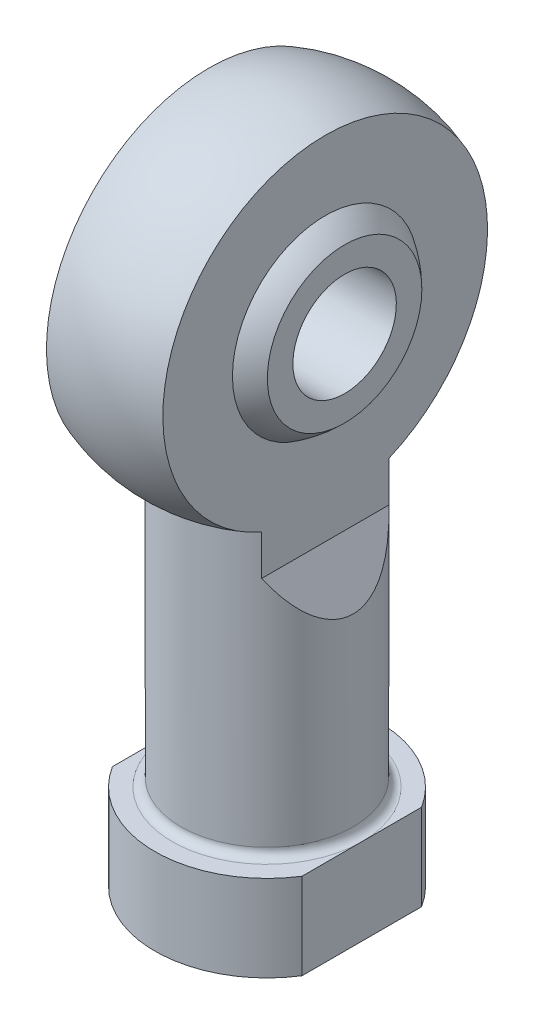
ISO-10303-21;
HEADER;
FILE_DESCRIPTION(('STEP AP214'),'2;1');
FILE_NAME('part.step','',(''),(''),'','','');
FILE_SCHEMA(('AUTOMOTIVE_DESIGN { 1 0 10303 214 1 1 1 1 }'));
ENDSEC;
DATA;
#1=APPLICATION_CONTEXT('core data for automotive mechanical design processes');
#2=APPLICATION_PROTOCOL_DEFINITION('international standard','automotive_design',2000,#1);
#3=PRODUCT_CONTEXT('',#1,'mechanical');
#4=PRODUCT('Part','Part','',(#3));
#5=PRODUCT_RELATED_PRODUCT_CATEGORY('part','',(#4));
#6=PRODUCT_DEFINITION_FORMATION('','',#4);
#7=PRODUCT_DEFINITION_CONTEXT('part definition',#1,'design');
#8=PRODUCT_DEFINITION('design','',#6,#7);
#9=PRODUCT_DEFINITION_SHAPE('','',#8);
#10=(LENGTH_UNIT() NAMED_UNIT(*) SI_UNIT(.MILLI.,.METRE.));
#11=(NAMED_UNIT(*) PLANE_ANGLE_UNIT() SI_UNIT($,.RADIAN.));
#12=(NAMED_UNIT(*) SI_UNIT($,.STERADIAN.) SOLID_ANGLE_UNIT());
#13=UNCERTAINTY_MEASURE_WITH_UNIT(LENGTH_MEASURE(1.E-05),#10,'distance_accuracy_value','');
#14=(GEOMETRIC_REPRESENTATION_CONTEXT(3) GLOBAL_UNCERTAINTY_ASSIGNED_CONTEXT((#13)) GLOBAL_UNIT_ASSIGNED_CONTEXT((#10,
#11,#12)) REPRESENTATION_CONTEXT('',''));
#15=CARTESIAN_POINT('',(0.,0.,0.));
#16=DIRECTION('',(0.,0.,1.));
#17=DIRECTION('',(1.,0.,0.));
#18=AXIS2_PLACEMENT_3D('',#15,#16,#17);
#19=CARTESIAN_POINT('',(0.,-15.0000000014074,0.));
#20=DIRECTION('',(0.,-1.,0.));
#21=DIRECTION('',(1.,0.,0.));
#22=AXIS2_PLACEMENT_3D('',#19,#20,#21);
#23=CONICAL_SURFACE('',#22,2.45849999907933,1.02974425745765);
#24=CARTESIAN_POINT('',(1.13686837721616E-10,-13.5227841660708,0.));
#25=VERTEX_POINT('',#24);
#26=VERTEX_LOOP('',#25);
#27=FACE_BOUND('',#26,.T.);
#28=CARTESIAN_POINT('',(0.,-15.,0.));
#29=DIRECTION('',(0.,-1.,0.));
#30=DIRECTION('',(1.,0.,0.));
#31=AXIS2_PLACEMENT_3D('',#28,#29,#30);
#32=CIRCLE('',#31,2.4585);
#33=CARTESIAN_POINT('',(2.4585,-15.,0.));
#34=VERTEX_POINT('',#33);
#35=EDGE_CURVE('E120',#34,#34,#32,.T.);
#36=ORIENTED_EDGE('',*,*,#35,.T.);
#37=EDGE_LOOP('',(#36));
#38=FACE_BOUND('',#37,.T.);
#39=ADVANCED_FACE('F17',(#27,#38),#23,.F.);
#40=CARTESIAN_POINT('',(0.,-22.5,0.));
#41=DIRECTION('',(0.,-1.,0.));
#42=DIRECTION('',(1.,0.,0.));
#43=AXIS2_PLACEMENT_3D('',#40,#41,#42);
#44=CYLINDRICAL_SURFACE('',#43,2.4585);
#45=CARTESIAN_POINT('',(0.,-29.4999999997572,0.));
#46=DIRECTION('',(0.,-1.,0.));
#47=DIRECTION('',(1.,0.,0.));
#48=AXIS2_PLACEMENT_3D('',#45,#46,#47);
#49=CIRCLE('',#48,2.45850000021618);
#50=CARTESIAN_POINT('',(2.45850000021619,-29.4999999997572,0.));
#51=VERTEX_POINT('',#50);
#52=EDGE_CURVE('E117',#51,#51,#49,.T.);
#53=ORIENTED_EDGE('',*,*,#52,.T.);
#54=EDGE_LOOP('',(#53));
#55=FACE_BOUND('',#54,.T.);
#56=ORIENTED_EDGE('',*,*,#35,.F.);
#57=EDGE_LOOP('',(#56));
#58=FACE_BOUND('',#57,.T.);
#59=ADVANCED_FACE('F181',(#55,#58),#44,.F.);
#60=CARTESIAN_POINT('',(0.,-30.0000000002001,0.));
#61=DIRECTION('',(0.,-1.,0.));
#62=DIRECTION('',(0.,0.,-1.));
#63=AXIS2_PLACEMENT_3D('',#60,#61,#62);
#64=CONICAL_SURFACE('',#63,2.95849999974961,0.785398162487953);
#65=CARTESIAN_POINT('',(0.,-30.0000000002001,0.));
#66=DIRECTION('',(0.,-1.,0.));
#67=DIRECTION('',(0.,0.,-1.));
#68=AXIS2_PLACEMENT_3D('',#65,#66,#67);
#69=CIRCLE('',#68,2.95849999974961);
#70=CARTESIAN_POINT('',(0.,-30.0000000002001,-2.95849999974961));
#71=VERTEX_POINT('',#70);
#72=EDGE_CURVE('E20',#71,#71,#69,.F.);
#73=ORIENTED_EDGE('',*,*,#72,.F.);
#74=EDGE_LOOP('',(#73));
#75=FACE_BOUND('',#74,.T.);
#76=ORIENTED_EDGE('',*,*,#52,.F.);
#77=EDGE_LOOP('',(#76));
#78=FACE_BOUND('',#77,.T.);
#79=ADVANCED_FACE('F177',(#75,#78),#64,.F.);
#80=CARTESIAN_POINT('',(42.6793157586781,0.,0.));
#81=DIRECTION('',(-1.,0.,0.));
#82=DIRECTION('',(0.,-1.,0.));
#83=AXIS2_PLACEMENT_3D('',#80,#81,#82);
#84=CYLINDRICAL_SURFACE('',#83,3.);
#85=CARTESIAN_POINT('',(-4.49999999999999,0.,0.));
#86=DIRECTION('',(-1.,0.,0.));
#87=DIRECTION('',(0.,-1.,0.));
#88=AXIS2_PLACEMENT_3D('',#85,#86,#87);
#89=CIRCLE('',#88,3.);
#90=CARTESIAN_POINT('',(-4.49999999999999,-3.,0.));
#91=VERTEX_POINT('',#90);
#92=EDGE_CURVE('E169',#91,#91,#89,.F.);
#93=ORIENTED_EDGE('',*,*,#92,.F.);
#94=EDGE_LOOP('',(#93));
#95=FACE_BOUND('',#94,.T.);
#96=CARTESIAN_POINT('',(4.5,0.,0.));
#97=DIRECTION('',(-1.,0.,0.));
#98=DIRECTION('',(0.,-1.,0.));
#99=AXIS2_PLACEMENT_3D('',#96,#97,#98);
#100=CIRCLE('',#99,3.);
#101=CARTESIAN_POINT('',(4.5,-3.,0.));
#102=VERTEX_POINT('',#101);
#103=EDGE_CURVE('E94',#102,#102,#100,.T.);
#104=ORIENTED_EDGE('',*,*,#103,.F.);
#105=EDGE_LOOP('',(#104));
#106=FACE_BOUND('',#105,.T.);
#107=ADVANCED_FACE('F180',(#95,#106),#84,.F.);
#108=CARTESIAN_POINT('',(3.25000000000001,-30.,0.));
#109=DIRECTION('',(0.,-1.,0.));
#110=DIRECTION('',(0.,0.,-1.));
#111=AXIS2_PLACEMENT_3D('',#108,#109,#110);
#112=PLANE('',#111);
#113=ORIENTED_EDGE('',*,*,#72,.T.);
#114=EDGE_LOOP('',(#113));
#115=FACE_BOUND('',#114,.T.);
#116=DIRECTION('',(0.,0.,-1.));
#117=VECTOR('',#116,1.);
#118=CARTESIAN_POINT('',(-5.49999999999999,-30.,-3.46410161513775));
#119=LINE('',#118,#117);
#120=CARTESIAN_POINT('',(-5.49999999999999,-30.,3.46410161513775));
#121=VERTEX_POINT('',#120);
#122=CARTESIAN_POINT('',(-5.49999999999999,-30.,-3.46410161513775));
#123=VERTEX_POINT('',#122);
#124=EDGE_CURVE('E89',#121,#123,#119,.T.);
#125=ORIENTED_EDGE('',*,*,#124,.T.);
#126=CARTESIAN_POINT('',(0.,-30.,0.));
#127=DIRECTION('',(0.,-1.,0.));
#128=DIRECTION('',(1.,0.,0.));
#129=AXIS2_PLACEMENT_3D('',#126,#127,#128);
#130=CIRCLE('',#129,6.5);
#131=CARTESIAN_POINT('',(5.50000000000001,-30.,-3.46410161513775));
#132=VERTEX_POINT('',#131);
#133=EDGE_CURVE('E104',#132,#123,#130,.F.);
#134=ORIENTED_EDGE('',*,*,#133,.F.);
#135=DIRECTION('',(0.,0.,1.));
#136=VECTOR('',#135,1.);
#137=CARTESIAN_POINT('',(5.50000000000001,-30.,3.46410161513775));
#138=LINE('',#137,#136);
#139=CARTESIAN_POINT('',(5.50000000000001,-30.,3.46410161513775));
#140=VERTEX_POINT('',#139);
#141=EDGE_CURVE('E91',#132,#140,#138,.T.);
#142=ORIENTED_EDGE('',*,*,#141,.T.);
#143=CARTESIAN_POINT('',(0.,-30.,0.));
#144=DIRECTION('',(0.,-1.,0.));
#145=DIRECTION('',(1.,0.,0.));
#146=AXIS2_PLACEMENT_3D('',#143,#144,#145);
#147=CIRCLE('',#146,6.5);
#148=EDGE_CURVE('E84',#121,#140,#147,.F.);
#149=ORIENTED_EDGE('',*,*,#148,.F.);
#150=EDGE_LOOP('',(#125,#134,#142,#149));
#151=FACE_BOUND('',#150,.T.);
#152=ADVANCED_FACE('F86',(#115,#151),#112,.T.);
#153=CARTESIAN_POINT('',(-4.49999999999999,0.,3.74011718443478));
#154=DIRECTION('',(-1.,0.,0.));
#155=DIRECTION('',(0.,0.,1.));
#156=AXIS2_PLACEMENT_3D('',#153,#154,#155);
#157=PLANE('',#156);
#158=ORIENTED_EDGE('',*,*,#92,.T.);
#159=EDGE_LOOP('',(#158));
#160=FACE_BOUND('',#159,.T.);
#161=CARTESIAN_POINT('',(-4.49999999999999,0.,0.));
#162=DIRECTION('',(1.,0.,0.));
#163=DIRECTION('',(0.,0.,-1.));
#164=AXIS2_PLACEMENT_3D('',#161,#162,#163);
#165=CIRCLE('',#164,4.48023436886956);
#166=CARTESIAN_POINT('',(-4.49999999999999,0.,-4.48023436886956));
#167=VERTEX_POINT('',#166);
#168=EDGE_CURVE('E111',#167,#167,#165,.T.);
#169=ORIENTED_EDGE('',*,*,#168,.F.);
#170=EDGE_LOOP('',(#169));
#171=FACE_BOUND('',#170,.T.);
#172=ADVANCED_FACE('F326',(#160,#171),#157,.T.);
#173=CARTESIAN_POINT('',(4.50000000000001,0.,3.74011718443478));
#174=DIRECTION('',(1.,0.,0.));
#175=DIRECTION('',(0.,0.,-1.));
#176=AXIS2_PLACEMENT_3D('',#173,#174,#175);
#177=PLANE('',#176);
#178=ORIENTED_EDGE('',*,*,#103,.T.);
#179=EDGE_LOOP('',(#178));
#180=FACE_BOUND('',#179,.T.);
#181=CARTESIAN_POINT('',(4.50000000000001,0.,0.));
#182=DIRECTION('',(1.,0.,0.));
#183=DIRECTION('',(0.,0.,-1.));
#184=AXIS2_PLACEMENT_3D('',#181,#182,#183);
#185=CIRCLE('',#184,4.48023436886955);
#186=CARTESIAN_POINT('',(4.50000000000001,0.,-4.48023436886955));
#187=VERTEX_POINT('',#186);
#188=EDGE_CURVE('E160',#187,#187,#185,.F.);
#189=ORIENTED_EDGE('',*,*,#188,.F.);
#190=EDGE_LOOP('',(#189));
#191=FACE_BOUND('',#190,.T.);
#192=ADVANCED_FACE('F323',(#180,#191),#177,.T.);
#193=CARTESIAN_POINT('',(0.,-27.5,0.));
#194=DIRECTION('',(0.,-1.,0.));
#195=DIRECTION('',(1.,0.,0.));
#196=AXIS2_PLACEMENT_3D('',#193,#194,#195);
#197=CYLINDRICAL_SURFACE('',#196,6.5);
#198=DIRECTION('',(0.,1.,0.));
#199=VECTOR('',#198,1.);
#200=CARTESIAN_POINT('',(-5.49999999999999,-30.,3.46410161513776));
#201=LINE('',#200,#199);
#202=CARTESIAN_POINT('',(-5.49999999999999,-25.,3.46410161513775));
#203=VERTEX_POINT('',#202);
#204=EDGE_CURVE('E97',#203,#121,#201,.F.);
#205=ORIENTED_EDGE('',*,*,#204,.T.);
#206=ORIENTED_EDGE('',*,*,#148,.T.);
#207=DIRECTION('',(0.,1.,0.));
#208=VECTOR('',#207,1.);
#209=CARTESIAN_POINT('',(5.50000000000001,-30.,3.46410161513775));
#210=LINE('',#209,#208);
#211=CARTESIAN_POINT('',(5.50000000000001,-25.,3.46410161513775));
#212=VERTEX_POINT('',#211);
#213=EDGE_CURVE('E115',#140,#212,#210,.T.);
#214=ORIENTED_EDGE('',*,*,#213,.T.);
#215=CARTESIAN_POINT('',(0.,-25.,0.));
#216=DIRECTION('',(0.,-1.,0.));
#217=DIRECTION('',(1.,0.,0.));
#218=AXIS2_PLACEMENT_3D('',#215,#216,#217);
#219=CIRCLE('',#218,6.5);
#220=EDGE_CURVE('E100',#203,#212,#219,.F.);
#221=ORIENTED_EDGE('',*,*,#220,.F.);
#222=EDGE_LOOP('',(#205,#206,#214,#221));
#223=FACE_BOUND('',#222,.T.);
#224=ADVANCED_FACE('F98',(#223),#197,.T.);
#225=CARTESIAN_POINT('',(5.50000000000001,-30.,3.46410161513775));
#226=DIRECTION('',(-1.,0.,0.));
#227=DIRECTION('',(0.,0.,1.));
#228=AXIS2_PLACEMENT_3D('',#225,#226,#227);
#229=PLANE('',#228);
#230=ORIENTED_EDGE('',*,*,#213,.F.);
#231=ORIENTED_EDGE('',*,*,#141,.F.);
#232=DIRECTION('',(0.,-1.,0.));
#233=VECTOR('',#232,1.);
#234=CARTESIAN_POINT('',(5.50000000000001,-27.5,-3.46410161513776));
#235=LINE('',#234,#233);
#236=CARTESIAN_POINT('',(5.50000000000001,-25.,-3.46410161513775));
#237=VERTEX_POINT('',#236);
#238=EDGE_CURVE('E166',#237,#132,#235,.T.);
#239=ORIENTED_EDGE('',*,*,#238,.F.);
#240=DIRECTION('',(0.,0.,1.));
#241=VECTOR('',#240,1.);
#242=CARTESIAN_POINT('',(5.50000000000001,-25.,0.));
#243=LINE('',#242,#241);
#244=CARTESIAN_POINT('',(5.50000000000001,-25.,0.));
#245=VERTEX_POINT('',#244);
#246=EDGE_CURVE('E157',#245,#237,#243,.F.);
#247=ORIENTED_EDGE('',*,*,#246,.F.);
#248=DIRECTION('',(0.,0.,1.));
#249=VECTOR('',#248,1.);
#250=CARTESIAN_POINT('',(5.50000000000001,-25.,0.));
#251=LINE('',#250,#249);
#252=EDGE_CURVE('E163',#212,#245,#251,.F.);
#253=ORIENTED_EDGE('',*,*,#252,.F.);
#254=EDGE_LOOP('',(#230,#231,#239,#247,#253));
#255=FACE_BOUND('',#254,.T.);
#256=ADVANCED_FACE('F316',(#255),#229,.F.);
#257=CARTESIAN_POINT('',(0.,-27.5,0.));
#258=DIRECTION('',(0.,-1.,0.));
#259=DIRECTION('',(1.,0.,0.));
#260=AXIS2_PLACEMENT_3D('',#257,#258,#259);
#261=CYLINDRICAL_SURFACE('',#260,6.5);
#262=DIRECTION('',(0.,1.,0.));
#263=VECTOR('',#262,1.);
#264=CARTESIAN_POINT('',(-5.49999999999999,-30.,-3.46410161513775));
#265=LINE('',#264,#263);
#266=CARTESIAN_POINT('',(-5.49999999999999,-25.,-3.46410161513775));
#267=VERTEX_POINT('',#266);
#268=EDGE_CURVE('E109',#123,#267,#265,.T.);
#269=ORIENTED_EDGE('',*,*,#268,.T.);
#270=CARTESIAN_POINT('',(0.,-25.,0.));
#271=DIRECTION('',(0.,-1.,0.));
#272=DIRECTION('',(1.,0.,0.));
#273=AXIS2_PLACEMENT_3D('',#270,#271,#272);
#274=CIRCLE('',#273,6.5);
#275=EDGE_CURVE('E153',#237,#267,#274,.F.);
#276=ORIENTED_EDGE('',*,*,#275,.F.);
#277=ORIENTED_EDGE('',*,*,#238,.T.);
#278=ORIENTED_EDGE('',*,*,#133,.T.);
#279=EDGE_LOOP('',(#269,#276,#277,#278));
#280=FACE_BOUND('',#279,.T.);
#281=ADVANCED_FACE('F313',(#280),#261,.T.);
#282=CARTESIAN_POINT('',(-5.49999999999999,-30.,-3.46410161513775));
#283=DIRECTION('',(1.,0.,0.));
#284=DIRECTION('',(0.,0.,-1.));
#285=AXIS2_PLACEMENT_3D('',#282,#283,#284);
#286=PLANE('',#285);
#287=ORIENTED_EDGE('',*,*,#268,.F.);
#288=ORIENTED_EDGE('',*,*,#124,.F.);
#289=ORIENTED_EDGE('',*,*,#204,.F.);
#290=DIRECTION('',(0.,0.,1.));
#291=VECTOR('',#290,1.);
#292=CARTESIAN_POINT('',(-5.49999999999999,-25.,0.));
#293=LINE('',#292,#291);
#294=CARTESIAN_POINT('',(-5.49999999999999,-25.,0.));
#295=VERTEX_POINT('',#294);
#296=EDGE_CURVE('E159',#295,#203,#293,.T.);
#297=ORIENTED_EDGE('',*,*,#296,.F.);
#298=DIRECTION('',(0.,0.,1.));
#299=VECTOR('',#298,1.);
#300=CARTESIAN_POINT('',(-5.49999999999999,-25.,0.));
#301=LINE('',#300,#299);
#302=EDGE_CURVE('E156',#267,#295,#301,.T.);
#303=ORIENTED_EDGE('',*,*,#302,.F.);
#304=EDGE_LOOP('',(#287,#288,#289,#297,#303));
#305=FACE_BOUND('',#304,.T.);
#306=ADVANCED_FACE('F107',(#305),#286,.F.);
#307=CARTESIAN_POINT('',(0.,0.,0.));
#308=DIRECTION('',(1.,0.,0.));
#309=DIRECTION('',(0.,1.,0.));
#310=AXIS2_PLACEMENT_3D('',#307,#308,#309);
#311=SPHERICAL_SURFACE('',#310,6.35);
#312=CARTESIAN_POINT('',(-3.37500000000001,0.,0.));
#313=DIRECTION('',(1.,0.,0.));
#314=DIRECTION('',(0.,0.,-1.));
#315=AXIS2_PLACEMENT_3D('',#312,#313,#314);
#316=CIRCLE('',#315,5.37883584058855);
#317=CARTESIAN_POINT('',(-3.37500000000001,0.,-5.37883584058855));
#318=VERTEX_POINT('',#317);
#319=EDGE_CURVE('E149',#318,#318,#316,.F.);
#320=ORIENTED_EDGE('',*,*,#319,.T.);
#321=EDGE_LOOP('',(#320));
#322=FACE_BOUND('',#321,.T.);
#323=ORIENTED_EDGE('',*,*,#168,.T.);
#324=EDGE_LOOP('',(#323));
#325=FACE_BOUND('',#324,.T.);
#326=ADVANCED_FACE('F306',(#322,#325),#311,.T.);
#327=CARTESIAN_POINT('',(0.,0.,0.));
#328=DIRECTION('',(1.,0.,0.));
#329=DIRECTION('',(0.,1.,0.));
#330=AXIS2_PLACEMENT_3D('',#327,#328,#329);
#331=SPHERICAL_SURFACE('',#330,6.35);
#332=CARTESIAN_POINT('',(3.375,0.,0.));
#333=DIRECTION('',(1.,0.,0.));
#334=DIRECTION('',(0.,0.,-1.));
#335=AXIS2_PLACEMENT_3D('',#332,#333,#334);
#336=CIRCLE('',#335,5.37883584058856);
#337=CARTESIAN_POINT('',(3.375,0.,-5.37883584058856));
#338=VERTEX_POINT('',#337);
#339=EDGE_CURVE('E142',#338,#338,#336,.T.);
#340=ORIENTED_EDGE('',*,*,#339,.T.);
#341=EDGE_LOOP('',(#340));
#342=FACE_BOUND('',#341,.T.);
#343=ORIENTED_EDGE('',*,*,#188,.T.);
#344=EDGE_LOOP('',(#343));
#345=FACE_BOUND('',#344,.T.);
#346=ADVANCED_FACE('F303',(#342,#345),#331,.T.);
#347=CARTESIAN_POINT('',(5.75000000000001,-25.,0.));
#348=DIRECTION('',(0.,1.,0.));
#349=DIRECTION('',(0.,0.,1.));
#350=AXIS2_PLACEMENT_3D('',#347,#348,#349);
#351=PLANE('',#350);
#352=ORIENTED_EDGE('',*,*,#296,.T.);
#353=ORIENTED_EDGE('',*,*,#220,.T.);
#354=ORIENTED_EDGE('',*,*,#252,.T.);
#355=CARTESIAN_POINT('',(0.,-25.,0.));
#356=DIRECTION('',(0.,1.,0.));
#357=DIRECTION('',(-1.,0.,0.));
#358=AXIS2_PLACEMENT_3D('',#355,#356,#357);
#359=CIRCLE('',#358,5.5);
#360=EDGE_CURVE('E218',#245,#295,#359,.F.);
#361=ORIENTED_EDGE('',*,*,#360,.T.);
#362=EDGE_LOOP('',(#352,#353,#354,#361));
#363=FACE_BOUND('',#362,.T.);
#364=ADVANCED_FACE('F240',(#363),#351,.T.);
#365=CARTESIAN_POINT('',(5.75000000000001,-25.,0.));
#366=DIRECTION('',(0.,1.,0.));
#367=DIRECTION('',(0.,0.,1.));
#368=AXIS2_PLACEMENT_3D('',#365,#366,#367);
#369=PLANE('',#368);
#370=ORIENTED_EDGE('',*,*,#302,.T.);
#371=CARTESIAN_POINT('',(0.,-25.,0.));
#372=DIRECTION('',(0.,1.,0.));
#373=DIRECTION('',(1.,0.,0.));
#374=AXIS2_PLACEMENT_3D('',#371,#372,#373);
#375=CIRCLE('',#374,5.5);
#376=EDGE_CURVE('E264',#295,#245,#375,.F.);
#377=ORIENTED_EDGE('',*,*,#376,.T.);
#378=ORIENTED_EDGE('',*,*,#246,.T.);
#379=ORIENTED_EDGE('',*,*,#275,.T.);
#380=EDGE_LOOP('',(#370,#377,#378,#379));
#381=FACE_BOUND('',#380,.T.);
#382=ADVANCED_FACE('F235',(#381),#369,.T.);
#383=CARTESIAN_POINT('',(-3.375,-11.,0.));
#384=DIRECTION('',(0.866025403784439,-0.499999999999999,0.));
#385=DIRECTION('',(0.499999999999999,0.866025403784439,0.));
#386=AXIS2_PLACEMENT_3D('',#383,#384,#385);
#387=PLANE('',#386);
#388=DIRECTION('',(0.,0.,-1.));
#389=VECTOR('',#388,1.);
#390=CARTESIAN_POINT('',(-3.37500000000001,-11.,0.));
#391=LINE('',#390,#389);
#392=CARTESIAN_POINT('',(-3.375,-11.,3.68908864084343));
#393=VERTEX_POINT('',#392);
#394=CARTESIAN_POINT('',(-3.375,-11.,-3.68908864084343));
#395=VERTEX_POINT('',#394);
#396=EDGE_CURVE('E152',#393,#395,#391,.T.);
#397=ORIENTED_EDGE('',*,*,#396,.T.);
#398=CARTESIAN_POINT('',(0.,-5.15432852445503,0.));
#399=DIRECTION('',(0.866025403784439,-0.499999999999999,0.));
#400=DIRECTION('',(-0.499999999999999,-0.866025403784439,0.));
#401=AXIS2_PLACEMENT_3D('',#398,#399,#400);
#402=ELLIPSE('',#401,10.,5.);
#403=EDGE_CURVE('E134',#393,#395,#402,.T.);
#404=ORIENTED_EDGE('',*,*,#403,.F.);
#405=EDGE_LOOP('',(#397,#404));
#406=FACE_BOUND('',#405,.T.);
#407=ADVANCED_FACE('F231',(#406),#387,.F.);
#408=CARTESIAN_POINT('',(-3.37500000000001,19.5728266199103,0.));
#409=DIRECTION('',(1.,0.,0.));
#410=DIRECTION('',(0.,0.,-1.));
#411=AXIS2_PLACEMENT_3D('',#408,#409,#410);
#412=PLANE('',#411);
#413=ORIENTED_EDGE('',*,*,#319,.F.);
#414=EDGE_LOOP('',(#413));
#415=FACE_BOUND('',#414,.T.);
#416=ORIENTED_EDGE('',*,*,#396,.F.);
#417=DIRECTION('',(0.,-1.,0.));
#418=VECTOR('',#417,1.);
#419=CARTESIAN_POINT('',(-3.37499999999999,-16.8301270189222,3.68908864084343));
#420=LINE('',#419,#418);
#421=CARTESIAN_POINT('',(-3.375,-8.66025403784439,3.68908864084342));
#422=VERTEX_POINT('',#421);
#423=EDGE_CURVE('E137',#422,#393,#420,.T.);
#424=ORIENTED_EDGE('',*,*,#423,.F.);
#425=CARTESIAN_POINT('',(-3.37500000000001,0.,0.));
#426=DIRECTION('',(1.,0.,0.));
#427=DIRECTION('',(0.,0.,-1.));
#428=AXIS2_PLACEMENT_3D('',#425,#426,#427);
#429=CIRCLE('',#428,9.41325528178218);
#430=CARTESIAN_POINT('',(-3.375,-8.66025403784439,-3.68908864084342));
#431=VERTEX_POINT('',#430);
#432=EDGE_CURVE('E147',#431,#422,#429,.T.);
#433=ORIENTED_EDGE('',*,*,#432,.F.);
#434=DIRECTION('',(0.,-1.,0.));
#435=VECTOR('',#434,1.);
#436=CARTESIAN_POINT('',(-3.37499999999999,-16.8301270189222,-3.68908864084343));
#437=LINE('',#436,#435);
#438=EDGE_CURVE('E133',#395,#431,#437,.F.);
#439=ORIENTED_EDGE('',*,*,#438,.F.);
#440=EDGE_LOOP('',(#416,#424,#433,#439));
#441=FACE_BOUND('',#440,.T.);
#442=ADVANCED_FACE('F227',(#415,#441),#412,.F.);
#443=CARTESIAN_POINT('',(0.,0.,0.));
#444=DIRECTION('',(1.,0.,0.));
#445=DIRECTION('',(0.,1.,0.));
#446=AXIS2_PLACEMENT_3D('',#443,#444,#445);
#447=SPHERICAL_SURFACE('',#446,10.);
#448=ORIENTED_EDGE('',*,*,#432,.T.);
#449=CARTESIAN_POINT('',(0.,-8.66025403784439,0.));
#450=DIRECTION('',(0.,-1.,0.));
#451=DIRECTION('',(1.,0.,0.));
#452=AXIS2_PLACEMENT_3D('',#449,#450,#451);
#453=CIRCLE('',#452,5.);
#454=CARTESIAN_POINT('',(3.375,-8.66025403784439,3.68908864084343));
#455=VERTEX_POINT('',#454);
#456=EDGE_CURVE('E138',#455,#422,#453,.T.);
#457=ORIENTED_EDGE('',*,*,#456,.F.);
#458=CARTESIAN_POINT('',(3.375,0.,0.));
#459=DIRECTION('',(1.,0.,0.));
#460=DIRECTION('',(0.,0.,-1.));
#461=AXIS2_PLACEMENT_3D('',#458,#459,#460);
#462=CIRCLE('',#461,9.41325528178217);
#463=CARTESIAN_POINT('',(3.375,-8.66025403784438,-3.68908864084343));
#464=VERTEX_POINT('',#463);
#465=EDGE_CURVE('E145',#455,#464,#462,.F.);
#466=ORIENTED_EDGE('',*,*,#465,.T.);
#467=CARTESIAN_POINT('',(0.,-8.66025403784439,0.));
#468=DIRECTION('',(0.,-1.,0.));
#469=DIRECTION('',(1.,0.,0.));
#470=AXIS2_PLACEMENT_3D('',#467,#468,#469);
#471=CIRCLE('',#470,5.);
#472=EDGE_CURVE('E130',#431,#464,#471,.T.);
#473=ORIENTED_EDGE('',*,*,#472,.F.);
#474=EDGE_LOOP('',(#448,#457,#466,#473));
#475=FACE_BOUND('',#474,.T.);
#476=ADVANCED_FACE('F223',(#475),#447,.T.);
#477=CARTESIAN_POINT('',(3.375,-11.,0.));
#478=DIRECTION('',(-1.,0.,0.));
#479=DIRECTION('',(0.,0.,1.));
#480=AXIS2_PLACEMENT_3D('',#477,#478,#479);
#481=PLANE('',#480);
#482=ORIENTED_EDGE('',*,*,#339,.F.);
#483=EDGE_LOOP('',(#482));
#484=FACE_BOUND('',#483,.T.);
#485=DIRECTION('',(0.,0.,1.));
#486=VECTOR('',#485,1.);
#487=CARTESIAN_POINT('',(3.375,-11.,0.));
#488=LINE('',#487,#486);
#489=CARTESIAN_POINT('',(3.375,-11.,3.68908864084343));
#490=VERTEX_POINT('',#489);
#491=CARTESIAN_POINT('',(3.375,-11.,-3.68908864084343));
#492=VERTEX_POINT('',#491);
#493=EDGE_CURVE('E35',#490,#492,#488,.F.);
#494=ORIENTED_EDGE('',*,*,#493,.T.);
#495=DIRECTION('',(0.,-1.,0.));
#496=VECTOR('',#495,1.);
#497=CARTESIAN_POINT('',(3.375,-16.8301270189222,-3.68908864084343));
#498=LINE('',#497,#496);
#499=EDGE_CURVE('E129',#464,#492,#498,.T.);
#500=ORIENTED_EDGE('',*,*,#499,.F.);
#501=ORIENTED_EDGE('',*,*,#465,.F.);
#502=DIRECTION('',(0.,-1.,0.));
#503=VECTOR('',#502,1.);
#504=CARTESIAN_POINT('',(3.375,-16.8301270189222,3.68908864084343));
#505=LINE('',#504,#503);
#506=EDGE_CURVE('E141',#490,#455,#505,.F.);
#507=ORIENTED_EDGE('',*,*,#506,.F.);
#508=EDGE_LOOP('',(#494,#500,#501,#507));
#509=FACE_BOUND('',#508,.T.);
#510=ADVANCED_FACE('F226',(#484,#509),#481,.F.);
#511=CARTESIAN_POINT('',(6.26235758390231,-16.0010500349381,0.));
#512=DIRECTION('',(-0.866025403784439,-0.5,0.));
#513=DIRECTION('',(0.5,-0.866025403784439,0.));
#514=AXIS2_PLACEMENT_3D('',#511,#512,#513);
#515=PLANE('',#514);
#516=ORIENTED_EDGE('',*,*,#493,.F.);
#517=CARTESIAN_POINT('',(0.,-5.15432852445505,0.));
#518=DIRECTION('',(-0.866025403784439,-0.5,0.));
#519=DIRECTION('',(0.5,-0.866025403784439,0.));
#520=AXIS2_PLACEMENT_3D('',#517,#518,#519);
#521=ELLIPSE('',#520,10.,5.);
#522=EDGE_CURVE('E26',#492,#490,#521,.T.);
#523=ORIENTED_EDGE('',*,*,#522,.F.);
#524=EDGE_LOOP('',(#516,#523));
#525=FACE_BOUND('',#524,.T.);
#526=ADVANCED_FACE('F203',(#525),#515,.F.);
#527=CARTESIAN_POINT('',(0.,-24.5,0.));
#528=DIRECTION('',(0.,-1.,0.));
#529=DIRECTION('',(0.,0.,-1.));
#530=AXIS2_PLACEMENT_3D('',#527,#528,#529);
#531=TOROIDAL_SURFACE('',#530,5.5,0.5);
#532=ORIENTED_EDGE('',*,*,#360,.F.);
#533=ORIENTED_EDGE('',*,*,#376,.F.);
#534=EDGE_LOOP('',(#532,#533));
#535=FACE_BOUND('',#534,.T.);
#536=CARTESIAN_POINT('',(0.,-24.5,0.));
#537=DIRECTION('',(0.,-1.,0.));
#538=DIRECTION('',(1.,0.,0.));
#539=AXIS2_PLACEMENT_3D('',#536,#537,#538);
#540=CIRCLE('',#539,5.);
#541=CARTESIAN_POINT('',(5.00000000000001,-24.5,0.));
#542=VERTEX_POINT('',#541);
#543=EDGE_CURVE('E11',#542,#542,#540,.F.);
#544=ORIENTED_EDGE('',*,*,#543,.F.);
#545=EDGE_LOOP('',(#544));
#546=FACE_BOUND('',#545,.T.);
#547=ADVANCED_FACE('F197',(#535,#546),#531,.F.);
#548=CARTESIAN_POINT('',(0.,-16.8301270189222,0.));
#549=DIRECTION('',(0.,-1.,0.));
#550=DIRECTION('',(1.,0.,0.));
#551=AXIS2_PLACEMENT_3D('',#548,#549,#550);
#552=CYLINDRICAL_SURFACE('',#551,5.);
#553=ORIENTED_EDGE('',*,*,#543,.T.);
#554=EDGE_LOOP('',(#553));
#555=FACE_BOUND('',#554,.T.);
#556=ORIENTED_EDGE('',*,*,#499,.T.);
#557=ORIENTED_EDGE('',*,*,#522,.T.);
#558=ORIENTED_EDGE('',*,*,#506,.T.);
#559=ORIENTED_EDGE('',*,*,#456,.T.);
#560=ORIENTED_EDGE('',*,*,#423,.T.);
#561=ORIENTED_EDGE('',*,*,#403,.T.);
#562=ORIENTED_EDGE('',*,*,#438,.T.);
#563=ORIENTED_EDGE('',*,*,#472,.T.);
#564=EDGE_LOOP('',(#556,#557,#558,#559,#560,#561,#562,#563));
#565=FACE_BOUND('',#564,.T.);
#566=ADVANCED_FACE('F195',(#555,#565),#552,.T.);
#567=CLOSED_SHELL('',(#39,#59,#79,#107,#152,#172,#192,#224,#256,#281,#306,#326,#346,#364,#382,
#407,#442,#476,#510,#526,#547,#566));
#568=MANIFOLD_SOLID_BREP('B1',#567);
#569=ADVANCED_BREP_SHAPE_REPRESENTATION('',(#18,#568),#14);
#570=SHAPE_DEFINITION_REPRESENTATION(#9,#569);
ENDSEC;
END-ISO-10303-21;
